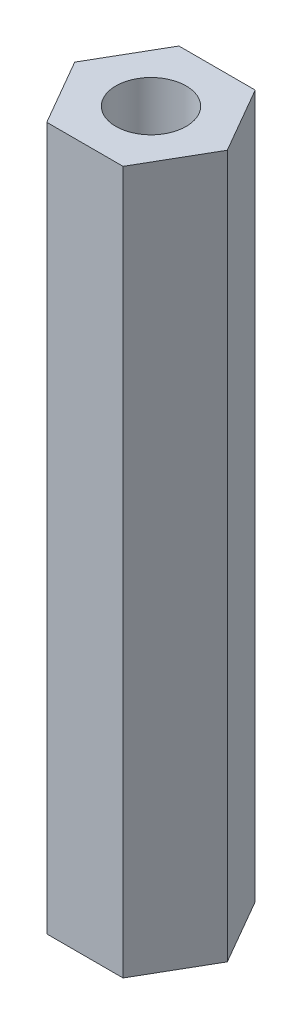
ISO-10303-21;
HEADER;
FILE_DESCRIPTION(('STEP AP214'),'2;1');
FILE_NAME('part.step','',(''),(''),'','','');
FILE_SCHEMA(('AUTOMOTIVE_DESIGN { 1 0 10303 214 1 1 1 1 }'));
ENDSEC;
DATA;
#1=APPLICATION_CONTEXT('core data for automotive mechanical design processes');
#2=APPLICATION_PROTOCOL_DEFINITION('international standard','automotive_design',2000,#1);
#3=PRODUCT_CONTEXT('',#1,'mechanical');
#4=PRODUCT('Part','Part','',(#3));
#5=PRODUCT_RELATED_PRODUCT_CATEGORY('part','',(#4));
#6=PRODUCT_DEFINITION_FORMATION('','',#4);
#7=PRODUCT_DEFINITION_CONTEXT('part definition',#1,'design');
#8=PRODUCT_DEFINITION('design','',#6,#7);
#9=PRODUCT_DEFINITION_SHAPE('','',#8);
#10=(LENGTH_UNIT() NAMED_UNIT(*) SI_UNIT(.MILLI.,.METRE.));
#11=(NAMED_UNIT(*) PLANE_ANGLE_UNIT() SI_UNIT($,.RADIAN.));
#12=(NAMED_UNIT(*) SI_UNIT($,.STERADIAN.) SOLID_ANGLE_UNIT());
#13=UNCERTAINTY_MEASURE_WITH_UNIT(LENGTH_MEASURE(1.E-05),#10,'distance_accuracy_value','');
#14=(GEOMETRIC_REPRESENTATION_CONTEXT(3) GLOBAL_UNCERTAINTY_ASSIGNED_CONTEXT((#13)) GLOBAL_UNIT_ASSIGNED_CONTEXT((#10,
#11,#12)) REPRESENTATION_CONTEXT('',''));
#15=CARTESIAN_POINT('',(0.,0.,0.));
#16=DIRECTION('',(0.,0.,1.));
#17=DIRECTION('',(1.,0.,0.));
#18=AXIS2_PLACEMENT_3D('',#15,#16,#17);
#19=CARTESIAN_POINT('',(2.71354626519124,12.5,0.));
#20=DIRECTION('',(-0.866025403784438,0.,0.5));
#21=DIRECTION('',(0.5,0.,0.866025403784439));
#22=AXIS2_PLACEMENT_3D('',#19,#20,#21);
#23=PLANE('',#22);
#24=DIRECTION('',(-0.5,0.,-0.866025403784438));
#25=VECTOR('',#24,1.);
#26=CARTESIAN_POINT('',(2.71354626519124,-12.5,0.));
#27=LINE('',#26,#25);
#28=CARTESIAN_POINT('',(2.71354626519124,-12.5,0.));
#29=VERTEX_POINT('',#28);
#30=CARTESIAN_POINT('',(1.35677313259562,-12.5,-2.35));
#31=VERTEX_POINT('',#30);
#32=EDGE_CURVE('E128',#29,#31,#27,.T.);
#33=ORIENTED_EDGE('',*,*,#32,.T.);
#34=DIRECTION('',(0.,-1.,0.));
#35=VECTOR('',#34,1.);
#36=CARTESIAN_POINT('',(1.35677313259562,12.5,-2.35));
#37=LINE('',#36,#35);
#38=CARTESIAN_POINT('',(1.35677313259562,12.5,-2.35));
#39=VERTEX_POINT('',#38);
#40=EDGE_CURVE('E11',#39,#31,#37,.T.);
#41=ORIENTED_EDGE('',*,*,#40,.F.);
#42=DIRECTION('',(-0.5,0.,-0.866025403784438));
#43=VECTOR('',#42,1.);
#44=CARTESIAN_POINT('',(2.71354626519124,12.5,0.));
#45=LINE('',#44,#43);
#46=CARTESIAN_POINT('',(2.71354626519124,12.5,0.));
#47=VERTEX_POINT('',#46);
#48=EDGE_CURVE('E145',#47,#39,#45,.T.);
#49=ORIENTED_EDGE('',*,*,#48,.F.);
#50=DIRECTION('',(0.,-1.,0.));
#51=VECTOR('',#50,1.);
#52=CARTESIAN_POINT('',(2.71354626519124,12.5,0.));
#53=LINE('',#52,#51);
#54=EDGE_CURVE('E124',#47,#29,#53,.T.);
#55=ORIENTED_EDGE('',*,*,#54,.T.);
#56=EDGE_LOOP('',(#33,#41,#49,#55));
#57=FACE_BOUND('',#56,.T.);
#58=ADVANCED_FACE('F39',(#57),#23,.F.);
#59=CARTESIAN_POINT('',(1.35677313259562,12.5,-2.35));
#60=DIRECTION('',(0.,0.,1.));
#61=DIRECTION('',(1.,0.,0.));
#62=AXIS2_PLACEMENT_3D('',#59,#60,#61);
#63=PLANE('',#62);
#64=DIRECTION('',(-1.,0.,0.));
#65=VECTOR('',#64,1.);
#66=CARTESIAN_POINT('',(1.35677313259562,-12.5,-2.35));
#67=LINE('',#66,#65);
#68=CARTESIAN_POINT('',(-1.35677313259562,-12.5,-2.35));
#69=VERTEX_POINT('',#68);
#70=EDGE_CURVE('E132',#31,#69,#67,.T.);
#71=ORIENTED_EDGE('',*,*,#70,.T.);
#72=DIRECTION('',(0.,-1.,0.));
#73=VECTOR('',#72,1.);
#74=CARTESIAN_POINT('',(-1.35677313259562,12.5,-2.35));
#75=LINE('',#74,#73);
#76=CARTESIAN_POINT('',(-1.35677313259562,12.5,-2.35));
#77=VERTEX_POINT('',#76);
#78=EDGE_CURVE('E48',#77,#69,#75,.T.);
#79=ORIENTED_EDGE('',*,*,#78,.F.);
#80=DIRECTION('',(-1.,0.,0.));
#81=VECTOR('',#80,1.);
#82=CARTESIAN_POINT('',(1.35677313259562,12.5,-2.35));
#83=LINE('',#82,#81);
#84=EDGE_CURVE('E93',#39,#77,#83,.T.);
#85=ORIENTED_EDGE('',*,*,#84,.F.);
#86=ORIENTED_EDGE('',*,*,#40,.T.);
#87=EDGE_LOOP('',(#71,#79,#85,#86));
#88=FACE_BOUND('',#87,.T.);
#89=ADVANCED_FACE('F174',(#88),#63,.F.);
#90=CARTESIAN_POINT('',(-1.35677313259562,12.5,-2.35));
#91=DIRECTION('',(0.866025403784439,0.,0.5));
#92=DIRECTION('',(0.5,0.,-0.866025403784439));
#93=AXIS2_PLACEMENT_3D('',#90,#91,#92);
#94=PLANE('',#93);
#95=DIRECTION('',(-0.5,0.,0.866025403784439));
#96=VECTOR('',#95,1.);
#97=CARTESIAN_POINT('',(-1.35677313259562,-12.5,-2.35));
#98=LINE('',#97,#96);
#99=CARTESIAN_POINT('',(-2.71354626519124,-12.5,0.));
#100=VERTEX_POINT('',#99);
#101=EDGE_CURVE('E136',#69,#100,#98,.T.);
#102=ORIENTED_EDGE('',*,*,#101,.T.);
#103=DIRECTION('',(0.,-1.,0.));
#104=VECTOR('',#103,1.);
#105=CARTESIAN_POINT('',(-2.71354626519124,12.5,0.));
#106=LINE('',#105,#104);
#107=CARTESIAN_POINT('',(-2.71354626519124,12.5,0.));
#108=VERTEX_POINT('',#107);
#109=EDGE_CURVE('E117',#108,#100,#106,.T.);
#110=ORIENTED_EDGE('',*,*,#109,.F.);
#111=DIRECTION('',(-0.5,0.,0.866025403784439));
#112=VECTOR('',#111,1.);
#113=CARTESIAN_POINT('',(-1.35677313259562,12.5,-2.35));
#114=LINE('',#113,#112);
#115=EDGE_CURVE('E106',#77,#108,#114,.T.);
#116=ORIENTED_EDGE('',*,*,#115,.F.);
#117=ORIENTED_EDGE('',*,*,#78,.T.);
#118=EDGE_LOOP('',(#102,#110,#116,#117));
#119=FACE_BOUND('',#118,.T.);
#120=ADVANCED_FACE('F155',(#119),#94,.F.);
#121=CARTESIAN_POINT('',(-2.71354626519124,12.5,0.));
#122=DIRECTION('',(0.866025403784438,0.,-0.5));
#123=DIRECTION('',(-0.5,0.,-0.866025403784438));
#124=AXIS2_PLACEMENT_3D('',#121,#122,#123);
#125=PLANE('',#124);
#126=DIRECTION('',(0.5,0.,0.866025403784438));
#127=VECTOR('',#126,1.);
#128=CARTESIAN_POINT('',(-2.71354626519124,-12.5,0.));
#129=LINE('',#128,#127);
#130=CARTESIAN_POINT('',(-1.35677313259562,-12.5,2.35));
#131=VERTEX_POINT('',#130);
#132=EDGE_CURVE('E115',#100,#131,#129,.T.);
#133=ORIENTED_EDGE('',*,*,#132,.T.);
#134=DIRECTION('',(0.,-1.,0.));
#135=VECTOR('',#134,1.);
#136=CARTESIAN_POINT('',(-1.35677313259562,12.5,2.35));
#137=LINE('',#136,#135);
#138=CARTESIAN_POINT('',(-1.35677313259562,12.5,2.35));
#139=VERTEX_POINT('',#138);
#140=EDGE_CURVE('E112',#139,#131,#137,.T.);
#141=ORIENTED_EDGE('',*,*,#140,.F.);
#142=DIRECTION('',(0.5,0.,0.866025403784438));
#143=VECTOR('',#142,1.);
#144=CARTESIAN_POINT('',(-2.71354626519124,12.5,0.));
#145=LINE('',#144,#143);
#146=EDGE_CURVE('E100',#108,#139,#145,.T.);
#147=ORIENTED_EDGE('',*,*,#146,.F.);
#148=ORIENTED_EDGE('',*,*,#109,.T.);
#149=EDGE_LOOP('',(#133,#141,#147,#148));
#150=FACE_BOUND('',#149,.T.);
#151=ADVANCED_FACE('F113',(#150),#125,.F.);
#152=CARTESIAN_POINT('',(-1.35677313259562,12.5,2.35));
#153=DIRECTION('',(0.,0.,-1.));
#154=DIRECTION('',(-1.,0.,0.));
#155=AXIS2_PLACEMENT_3D('',#152,#153,#154);
#156=PLANE('',#155);
#157=DIRECTION('',(1.,0.,0.));
#158=VECTOR('',#157,1.);
#159=CARTESIAN_POINT('',(-1.35677313259562,-12.5,2.35));
#160=LINE('',#159,#158);
#161=CARTESIAN_POINT('',(1.35677313259562,-12.5,2.35));
#162=VERTEX_POINT('',#161);
#163=EDGE_CURVE('E79',#131,#162,#160,.T.);
#164=ORIENTED_EDGE('',*,*,#163,.T.);
#165=DIRECTION('',(0.,-1.,0.));
#166=VECTOR('',#165,1.);
#167=CARTESIAN_POINT('',(1.35677313259562,12.5,2.35));
#168=LINE('',#167,#166);
#169=CARTESIAN_POINT('',(1.35677313259562,12.5,2.35));
#170=VERTEX_POINT('',#169);
#171=EDGE_CURVE('E118',#170,#162,#168,.T.);
#172=ORIENTED_EDGE('',*,*,#171,.F.);
#173=DIRECTION('',(1.,0.,0.));
#174=VECTOR('',#173,1.);
#175=CARTESIAN_POINT('',(-1.35677313259562,12.5,2.35));
#176=LINE('',#175,#174);
#177=EDGE_CURVE('E104',#139,#170,#176,.T.);
#178=ORIENTED_EDGE('',*,*,#177,.F.);
#179=ORIENTED_EDGE('',*,*,#140,.T.);
#180=EDGE_LOOP('',(#164,#172,#178,#179));
#181=FACE_BOUND('',#180,.T.);
#182=ADVANCED_FACE('F120',(#181),#156,.F.);
#183=CARTESIAN_POINT('',(1.35677313259562,12.5,2.35));
#184=DIRECTION('',(-0.866025403784439,0.,-0.5));
#185=DIRECTION('',(-0.5,0.,0.866025403784439));
#186=AXIS2_PLACEMENT_3D('',#183,#184,#185);
#187=PLANE('',#186);
#188=DIRECTION('',(0.5,0.,-0.866025403784439));
#189=VECTOR('',#188,1.);
#190=CARTESIAN_POINT('',(1.35677313259562,-12.5,2.35));
#191=LINE('',#190,#189);
#192=EDGE_CURVE('E85',#162,#29,#191,.T.);
#193=ORIENTED_EDGE('',*,*,#192,.T.);
#194=ORIENTED_EDGE('',*,*,#54,.F.);
#195=DIRECTION('',(0.5,0.,-0.866025403784439));
#196=VECTOR('',#195,1.);
#197=CARTESIAN_POINT('',(1.35677313259562,12.5,2.35));
#198=LINE('',#197,#196);
#199=EDGE_CURVE('E56',#170,#47,#198,.T.);
#200=ORIENTED_EDGE('',*,*,#199,.F.);
#201=ORIENTED_EDGE('',*,*,#171,.T.);
#202=EDGE_LOOP('',(#193,#194,#200,#201));
#203=FACE_BOUND('',#202,.T.);
#204=ADVANCED_FACE('F162',(#203),#187,.F.);
#205=CARTESIAN_POINT('',(0.,12.5,0.));
#206=DIRECTION('',(0.,1.,0.));
#207=DIRECTION('',(0.,0.,1.));
#208=AXIS2_PLACEMENT_3D('',#205,#206,#207);
#209=PLANE('',#208);
#210=CARTESIAN_POINT('',(0.,12.5,0.));
#211=DIRECTION('',(0.,1.,0.));
#212=DIRECTION('',(0.,0.,1.));
#213=AXIS2_PLACEMENT_3D('',#210,#211,#212);
#214=CIRCLE('',#213,1.25);
#215=CARTESIAN_POINT('',(0.,12.5,1.25));
#216=VERTEX_POINT('',#215);
#217=EDGE_CURVE('E258',#216,#216,#214,.T.);
#218=ORIENTED_EDGE('',*,*,#217,.F.);
#219=EDGE_LOOP('',(#218));
#220=FACE_BOUND('',#219,.T.);
#221=ORIENTED_EDGE('',*,*,#48,.T.);
#222=ORIENTED_EDGE('',*,*,#84,.T.);
#223=ORIENTED_EDGE('',*,*,#115,.T.);
#224=ORIENTED_EDGE('',*,*,#146,.T.);
#225=ORIENTED_EDGE('',*,*,#177,.T.);
#226=ORIENTED_EDGE('',*,*,#199,.T.);
#227=EDGE_LOOP('',(#221,#222,#223,#224,#225,#226));
#228=FACE_BOUND('',#227,.T.);
#229=ADVANCED_FACE('F102',(#220,#228),#209,.T.);
#230=CARTESIAN_POINT('',(0.,-12.5,0.));
#231=DIRECTION('',(0.,1.,0.));
#232=DIRECTION('',(0.,0.,1.));
#233=AXIS2_PLACEMENT_3D('',#230,#231,#232);
#234=PLANE('',#233);
#235=CARTESIAN_POINT('',(0.,-12.5,0.));
#236=DIRECTION('',(0.,1.,0.));
#237=DIRECTION('',(0.,0.,1.));
#238=AXIS2_PLACEMENT_3D('',#235,#236,#237);
#239=CIRCLE('',#238,1.25);
#240=CARTESIAN_POINT('',(0.,-12.5,1.25));
#241=VERTEX_POINT('',#240);
#242=EDGE_CURVE('E259',#241,#241,#239,.T.);
#243=ORIENTED_EDGE('',*,*,#242,.T.);
#244=EDGE_LOOP('',(#243));
#245=FACE_BOUND('',#244,.T.);
#246=ORIENTED_EDGE('',*,*,#32,.F.);
#247=ORIENTED_EDGE('',*,*,#192,.F.);
#248=ORIENTED_EDGE('',*,*,#163,.F.);
#249=ORIENTED_EDGE('',*,*,#132,.F.);
#250=ORIENTED_EDGE('',*,*,#101,.F.);
#251=ORIENTED_EDGE('',*,*,#70,.F.);
#252=EDGE_LOOP('',(#246,#247,#248,#249,#250,#251));
#253=FACE_BOUND('',#252,.T.);
#254=ADVANCED_FACE('F158',(#245,#253),#234,.F.);
#255=CARTESIAN_POINT('',(0.,5.5,0.));
#256=DIRECTION('',(0.,1.,0.));
#257=DIRECTION('',(0.,0.,1.));
#258=AXIS2_PLACEMENT_3D('',#255,#256,#257);
#259=CYLINDRICAL_SURFACE('',#258,1.25);
#260=CARTESIAN_POINT('',(0.,5.5,0.));
#261=DIRECTION('',(0.,1.,0.));
#262=DIRECTION('',(0.,0.,1.));
#263=AXIS2_PLACEMENT_3D('',#260,#261,#262);
#264=CIRCLE('',#263,1.25);
#265=CARTESIAN_POINT('',(0.,5.5,1.25));
#266=VERTEX_POINT('',#265);
#267=EDGE_CURVE('E133',#266,#266,#264,.T.);
#268=ORIENTED_EDGE('',*,*,#267,.F.);
#269=EDGE_LOOP('',(#268));
#270=FACE_BOUND('',#269,.T.);
#271=ORIENTED_EDGE('',*,*,#217,.T.);
#272=EDGE_LOOP('',(#271));
#273=FACE_BOUND('',#272,.T.);
#274=ADVANCED_FACE('F209',(#270,#273),#259,.F.);
#275=CARTESIAN_POINT('',(0.,5.5,0.));
#276=DIRECTION('',(0.,1.,0.));
#277=DIRECTION('',(0.,0.,1.));
#278=AXIS2_PLACEMENT_3D('',#275,#276,#277);
#279=PLANE('',#278);
#280=ORIENTED_EDGE('',*,*,#267,.T.);
#281=EDGE_LOOP('',(#280));
#282=FACE_BOUND('',#281,.T.);
#283=ADVANCED_FACE('F214',(#282),#279,.T.);
#284=CARTESIAN_POINT('',(0.,-5.5,0.));
#285=DIRECTION('',(0.,-1.,0.));
#286=DIRECTION('',(0.,0.,-1.));
#287=AXIS2_PLACEMENT_3D('',#284,#285,#286);
#288=CYLINDRICAL_SURFACE('',#287,1.25);
#289=CARTESIAN_POINT('',(0.,-5.5,0.));
#290=DIRECTION('',(0.,1.,0.));
#291=DIRECTION('',(0.,0.,1.));
#292=AXIS2_PLACEMENT_3D('',#289,#290,#291);
#293=CIRCLE('',#292,1.25);
#294=CARTESIAN_POINT('',(0.,-5.5,1.25));
#295=VERTEX_POINT('',#294);
#296=EDGE_CURVE('E256',#295,#295,#293,.T.);
#297=ORIENTED_EDGE('',*,*,#296,.T.);
#298=EDGE_LOOP('',(#297));
#299=FACE_BOUND('',#298,.T.);
#300=ORIENTED_EDGE('',*,*,#242,.F.);
#301=EDGE_LOOP('',(#300));
#302=FACE_BOUND('',#301,.T.);
#303=ADVANCED_FACE('F224',(#299,#302),#288,.F.);
#304=CARTESIAN_POINT('',(0.,-5.5,0.));
#305=DIRECTION('',(0.,-1.,0.));
#306=DIRECTION('',(0.,0.,1.));
#307=AXIS2_PLACEMENT_3D('',#304,#305,#306);
#308=PLANE('',#307);
#309=ORIENTED_EDGE('',*,*,#296,.F.);
#310=EDGE_LOOP('',(#309));
#311=FACE_BOUND('',#310,.T.);
#312=ADVANCED_FACE('F240',(#311),#308,.T.);
#313=CLOSED_SHELL('',(#58,#89,#120,#151,#182,#204,#229,#254,#274,#283,#303,#312));
#314=MANIFOLD_SOLID_BREP('B2',#313);
#315=ADVANCED_BREP_SHAPE_REPRESENTATION('',(#18,#314),#14);
#316=SHAPE_DEFINITION_REPRESENTATION(#9,#315);
ENDSEC;
END-ISO-10303-21;
